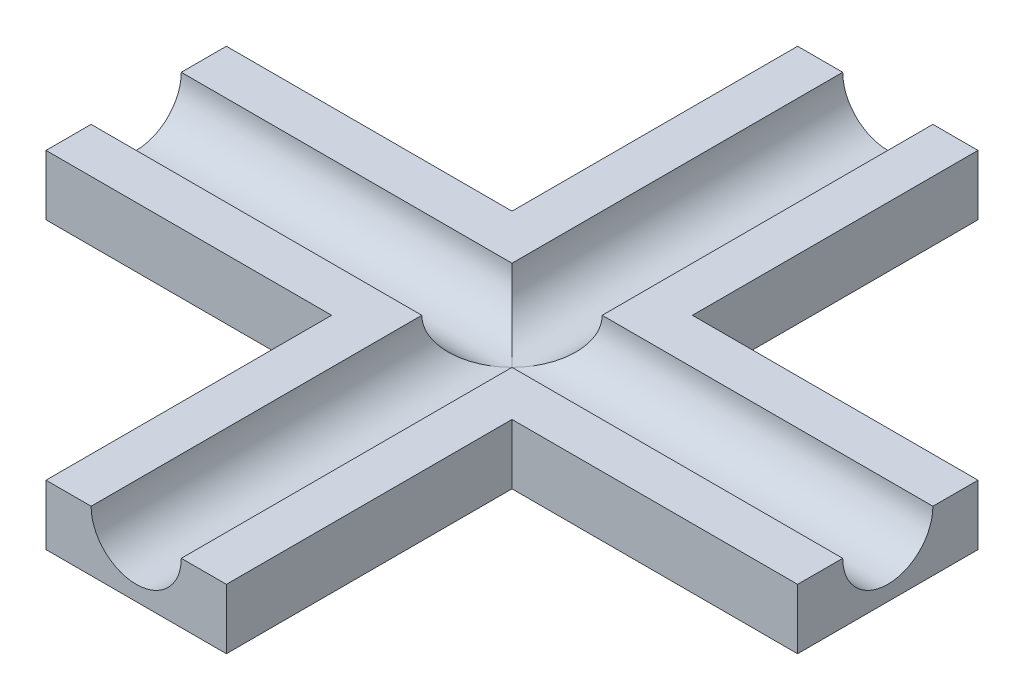
ISO-10303-21;
HEADER;
FILE_DESCRIPTION(('STEP AP214'),'2;1');
FILE_NAME('part.step','',(''),(''),'','','');
FILE_SCHEMA(('AUTOMOTIVE_DESIGN { 1 0 10303 214 1 1 1 1 }'));
ENDSEC;
DATA;
#1=APPLICATION_CONTEXT('core data for automotive mechanical design processes');
#2=APPLICATION_PROTOCOL_DEFINITION('international standard','automotive_design',2000,#1);
#3=PRODUCT_CONTEXT('',#1,'mechanical');
#4=PRODUCT('Part','Part','',(#3));
#5=PRODUCT_RELATED_PRODUCT_CATEGORY('part','',(#4));
#6=PRODUCT_DEFINITION_FORMATION('','',#4);
#7=PRODUCT_DEFINITION_CONTEXT('part definition',#1,'design');
#8=PRODUCT_DEFINITION('design','',#6,#7);
#9=PRODUCT_DEFINITION_SHAPE('','',#8);
#10=(LENGTH_UNIT() NAMED_UNIT(*) SI_UNIT(.MILLI.,.METRE.));
#11=(NAMED_UNIT(*) PLANE_ANGLE_UNIT() SI_UNIT($,.RADIAN.));
#12=(NAMED_UNIT(*) SI_UNIT($,.STERADIAN.) SOLID_ANGLE_UNIT());
#13=UNCERTAINTY_MEASURE_WITH_UNIT(LENGTH_MEASURE(1.E-05),#10,'distance_accuracy_value','');
#14=(GEOMETRIC_REPRESENTATION_CONTEXT(3) GLOBAL_UNCERTAINTY_ASSIGNED_CONTEXT((#13)) GLOBAL_UNIT_ASSIGNED_CONTEXT((#10,
#11,#12)) REPRESENTATION_CONTEXT('',''));
#15=CARTESIAN_POINT('',(0.,0.,0.));
#16=DIRECTION('',(0.,0.,1.));
#17=DIRECTION('',(1.,0.,0.));
#18=AXIS2_PLACEMENT_3D('',#15,#16,#17);
#19=CARTESIAN_POINT('',(-25.001,4.,0.));
#20=DIRECTION('',(1.,0.,0.));
#21=DIRECTION('',(0.,0.,-1.));
#22=AXIS2_PLACEMENT_3D('',#19,#20,#21);
#23=CYLINDRICAL_SURFACE('',#22,3.);
#24=CARTESIAN_POINT('',(0.,4.,0.));
#25=DIRECTION('',(0.707106781186551,0.,-0.707106781186544));
#26=DIRECTION('',(-0.707106781186544,0.,-0.707106781186551));
#27=AXIS2_PLACEMENT_3D('',#24,#25,#26);
#28=ELLIPSE('',#27,4.24264068711926,3.);
#29=CARTESIAN_POINT('',(-2.99999999999997,4.,-3.));
#30=VERTEX_POINT('',#29);
#31=CARTESIAN_POINT('',(0.,1.,0.));
#32=VERTEX_POINT('',#31);
#33=EDGE_CURVE('E206',#30,#32,#28,.F.);
#34=ORIENTED_EDGE('',*,*,#33,.F.);
#35=DIRECTION('',(1.,0.,0.));
#36=VECTOR('',#35,1.);
#37=CARTESIAN_POINT('',(-25.001,4.,-3.));
#38=LINE('',#37,#36);
#39=CARTESIAN_POINT('',(-25.,4.,-3.));
#40=VERTEX_POINT('',#39);
#41=EDGE_CURVE('E329',#30,#40,#38,.F.);
#42=ORIENTED_EDGE('',*,*,#41,.T.);
#43=CARTESIAN_POINT('',(-25.,4.,0.));
#44=DIRECTION('',(1.,0.,0.));
#45=DIRECTION('',(0.,0.,-1.));
#46=AXIS2_PLACEMENT_3D('',#43,#44,#45);
#47=CIRCLE('',#46,3.);
#48=CARTESIAN_POINT('',(-25.,4.,3.));
#49=VERTEX_POINT('',#48);
#50=EDGE_CURVE('E225',#40,#49,#47,.F.);
#51=ORIENTED_EDGE('',*,*,#50,.T.);
#52=DIRECTION('',(1.,0.,0.));
#53=VECTOR('',#52,1.);
#54=CARTESIAN_POINT('',(-25.001,4.,3.));
#55=LINE('',#54,#53);
#56=CARTESIAN_POINT('',(-3.00000000000001,4.,3.));
#57=VERTEX_POINT('',#56);
#58=EDGE_CURVE('E303',#49,#57,#55,.T.);
#59=ORIENTED_EDGE('',*,*,#58,.T.);
#60=CARTESIAN_POINT('',(0.,4.,0.));
#61=DIRECTION('',(0.707106781186546,0.,0.707106781186549));
#62=DIRECTION('',(-0.707106781186549,0.,0.707106781186546));
#63=AXIS2_PLACEMENT_3D('',#60,#61,#62);
#64=ELLIPSE('',#63,4.24264068711929,3.);
#65=EDGE_CURVE('E214',#32,#57,#64,.F.);
#66=ORIENTED_EDGE('',*,*,#65,.F.);
#67=EDGE_LOOP('',(#34,#42,#51,#59,#66));
#68=FACE_BOUND('',#67,.T.);
#69=ADVANCED_FACE('F33',(#68),#23,.F.);
#70=CARTESIAN_POINT('',(-25.,10.,25.));
#71=DIRECTION('',(1.,0.,0.));
#72=DIRECTION('',(0.,0.,-1.));
#73=AXIS2_PLACEMENT_3D('',#70,#71,#72);
#74=PLANE('',#73);
#75=DIRECTION('',(0.,1.,0.));
#76=VECTOR('',#75,1.);
#77=CARTESIAN_POINT('',(-25.,-0.000999999999999265,6.00000000000001));
#78=LINE('',#77,#76);
#79=CARTESIAN_POINT('',(-25.,0.,6.00000000000001));
#80=VERTEX_POINT('',#79);
#81=CARTESIAN_POINT('',(-25.,4.,6.00000000000001));
#82=VERTEX_POINT('',#81);
#83=EDGE_CURVE('E271',#80,#82,#78,.T.);
#84=ORIENTED_EDGE('',*,*,#83,.T.);
#85=DIRECTION('',(0.,0.,-1.));
#86=VECTOR('',#85,1.);
#87=CARTESIAN_POINT('',(-25.,4.,25.));
#88=LINE('',#87,#86);
#89=EDGE_CURVE('E281',#82,#49,#88,.T.);
#90=ORIENTED_EDGE('',*,*,#89,.T.);
#91=ORIENTED_EDGE('',*,*,#50,.F.);
#92=CARTESIAN_POINT('',(-25.,4.,-6.));
#93=VERTEX_POINT('',#92);
#94=EDGE_CURVE('E305',#40,#93,#88,.T.);
#95=ORIENTED_EDGE('',*,*,#94,.T.);
#96=DIRECTION('',(0.,1.,0.));
#97=VECTOR('',#96,1.);
#98=CARTESIAN_POINT('',(-25.,-0.000999999999999265,-6.));
#99=LINE('',#98,#97);
#100=CARTESIAN_POINT('',(-25.,0.,-6.));
#101=VERTEX_POINT('',#100);
#102=EDGE_CURVE('E257',#101,#93,#99,.T.);
#103=ORIENTED_EDGE('',*,*,#102,.F.);
#104=DIRECTION('',(0.,0.,1.));
#105=VECTOR('',#104,1.);
#106=CARTESIAN_POINT('',(-25.,0.,25.));
#107=LINE('',#106,#105);
#108=EDGE_CURVE('E228',#101,#80,#107,.T.);
#109=ORIENTED_EDGE('',*,*,#108,.T.);
#110=EDGE_LOOP('',(#84,#90,#91,#95,#103,#109));
#111=FACE_BOUND('',#110,.T.);
#112=ADVANCED_FACE('F35',(#111),#74,.F.);
#113=CARTESIAN_POINT('',(25.,10.,25.));
#114=DIRECTION('',(0.,0.,-1.));
#115=DIRECTION('',(-1.,0.,0.));
#116=AXIS2_PLACEMENT_3D('',#113,#114,#115);
#117=PLANE('',#116);
#118=DIRECTION('',(0.,1.,0.));
#119=VECTOR('',#118,1.);
#120=CARTESIAN_POINT('',(6.,-0.000999999999999265,25.));
#121=LINE('',#120,#119);
#122=CARTESIAN_POINT('',(6.,0.,25.));
#123=VERTEX_POINT('',#122);
#124=CARTESIAN_POINT('',(6.,4.,25.));
#125=VERTEX_POINT('',#124);
#126=EDGE_CURVE('E181',#123,#125,#121,.T.);
#127=ORIENTED_EDGE('',*,*,#126,.T.);
#128=DIRECTION('',(-1.,0.,0.));
#129=VECTOR('',#128,1.);
#130=CARTESIAN_POINT('',(25.,4.,25.));
#131=LINE('',#130,#129);
#132=CARTESIAN_POINT('',(2.99999999999991,4.,25.));
#133=VERTEX_POINT('',#132);
#134=EDGE_CURVE('E164',#125,#133,#131,.T.);
#135=ORIENTED_EDGE('',*,*,#134,.T.);
#136=CARTESIAN_POINT('',(0.,4.,25.));
#137=DIRECTION('',(0.,0.,1.));
#138=DIRECTION('',(1.,0.,0.));
#139=AXIS2_PLACEMENT_3D('',#136,#137,#138);
#140=CIRCLE('',#139,3.);
#141=CARTESIAN_POINT('',(-3.00000000000009,4.,25.));
#142=VERTEX_POINT('',#141);
#143=EDGE_CURVE('E217',#142,#133,#140,.T.);
#144=ORIENTED_EDGE('',*,*,#143,.F.);
#145=CARTESIAN_POINT('',(-6.00000000000001,4.,25.));
#146=VERTEX_POINT('',#145);
#147=EDGE_CURVE('E299',#142,#146,#131,.T.);
#148=ORIENTED_EDGE('',*,*,#147,.T.);
#149=DIRECTION('',(0.,1.,0.));
#150=VECTOR('',#149,1.);
#151=CARTESIAN_POINT('',(-6.00000000000001,-0.000999999999999265,25.));
#152=LINE('',#151,#150);
#153=CARTESIAN_POINT('',(-6.00000000000001,0.,25.));
#154=VERTEX_POINT('',#153);
#155=EDGE_CURVE('E274',#154,#146,#152,.T.);
#156=ORIENTED_EDGE('',*,*,#155,.F.);
#157=DIRECTION('',(1.,0.,0.));
#158=VECTOR('',#157,1.);
#159=CARTESIAN_POINT('',(25.,0.,25.));
#160=LINE('',#159,#158);
#161=EDGE_CURVE('E231',#154,#123,#160,.T.);
#162=ORIENTED_EDGE('',*,*,#161,.T.);
#163=EDGE_LOOP('',(#127,#135,#144,#148,#156,#162));
#164=FACE_BOUND('',#163,.T.);
#165=ADVANCED_FACE('F297',(#164),#117,.F.);
#166=CARTESIAN_POINT('',(25.,10.,25.));
#167=DIRECTION('',(-1.,0.,0.));
#168=DIRECTION('',(0.,0.,1.));
#169=AXIS2_PLACEMENT_3D('',#166,#167,#168);
#170=PLANE('',#169);
#171=DIRECTION('',(0.,1.,0.));
#172=VECTOR('',#171,1.);
#173=CARTESIAN_POINT('',(25.,-0.000999999999999265,-6.00000000000001));
#174=LINE('',#173,#172);
#175=CARTESIAN_POINT('',(25.,0.,-6.00000000000001));
#176=VERTEX_POINT('',#175);
#177=CARTESIAN_POINT('',(25.,4.,-6.00000000000001));
#178=VERTEX_POINT('',#177);
#179=EDGE_CURVE('E197',#176,#178,#174,.T.);
#180=ORIENTED_EDGE('',*,*,#179,.T.);
#181=DIRECTION('',(0.,0.,1.));
#182=VECTOR('',#181,1.);
#183=CARTESIAN_POINT('',(25.,4.,25.));
#184=LINE('',#183,#182);
#185=CARTESIAN_POINT('',(25.,4.,-3.));
#186=VERTEX_POINT('',#185);
#187=EDGE_CURVE('E313',#178,#186,#184,.T.);
#188=ORIENTED_EDGE('',*,*,#187,.T.);
#189=CARTESIAN_POINT('',(25.,4.,0.));
#190=DIRECTION('',(1.,0.,0.));
#191=DIRECTION('',(0.,0.,-1.));
#192=AXIS2_PLACEMENT_3D('',#189,#190,#191);
#193=CIRCLE('',#192,3.);
#194=CARTESIAN_POINT('',(25.,4.,3.));
#195=VERTEX_POINT('',#194);
#196=EDGE_CURVE('E222',#195,#186,#193,.T.);
#197=ORIENTED_EDGE('',*,*,#196,.F.);
#198=CARTESIAN_POINT('',(25.,4.,6.));
#199=VERTEX_POINT('',#198);
#200=EDGE_CURVE('E175',#195,#199,#184,.T.);
#201=ORIENTED_EDGE('',*,*,#200,.T.);
#202=DIRECTION('',(0.,1.,0.));
#203=VECTOR('',#202,1.);
#204=CARTESIAN_POINT('',(25.,-0.000999999999999265,6.));
#205=LINE('',#204,#203);
#206=CARTESIAN_POINT('',(25.,0.,6.));
#207=VERTEX_POINT('',#206);
#208=EDGE_CURVE('E174',#207,#199,#205,.T.);
#209=ORIENTED_EDGE('',*,*,#208,.F.);
#210=DIRECTION('',(0.,0.,-1.));
#211=VECTOR('',#210,1.);
#212=CARTESIAN_POINT('',(25.,0.,25.));
#213=LINE('',#212,#211);
#214=EDGE_CURVE('E234',#207,#176,#213,.T.);
#215=ORIENTED_EDGE('',*,*,#214,.T.);
#216=EDGE_LOOP('',(#180,#188,#197,#201,#209,#215));
#217=FACE_BOUND('',#216,.T.);
#218=ADVANCED_FACE('F344',(#217),#170,.F.);
#219=CARTESIAN_POINT('',(25.,10.,-25.));
#220=DIRECTION('',(0.,0.,1.));
#221=DIRECTION('',(1.,0.,0.));
#222=AXIS2_PLACEMENT_3D('',#219,#220,#221);
#223=PLANE('',#222);
#224=DIRECTION('',(0.,1.,0.));
#225=VECTOR('',#224,1.);
#226=CARTESIAN_POINT('',(-6.,-0.000999999999999265,-25.));
#227=LINE('',#226,#225);
#228=CARTESIAN_POINT('',(-6.,0.,-25.));
#229=VERTEX_POINT('',#228);
#230=CARTESIAN_POINT('',(-6.,4.,-25.));
#231=VERTEX_POINT('',#230);
#232=EDGE_CURVE('E194',#229,#231,#227,.T.);
#233=ORIENTED_EDGE('',*,*,#232,.T.);
#234=DIRECTION('',(1.,0.,0.));
#235=VECTOR('',#234,1.);
#236=CARTESIAN_POINT('',(25.,4.,-25.));
#237=LINE('',#236,#235);
#238=CARTESIAN_POINT('',(-2.99999999999974,4.,-25.));
#239=VERTEX_POINT('',#238);
#240=EDGE_CURVE('E322',#231,#239,#237,.T.);
#241=ORIENTED_EDGE('',*,*,#240,.T.);
#242=CARTESIAN_POINT('',(2.61861100413235E-13,4.,-25.));
#243=DIRECTION('',(0.,0.,-1.));
#244=DIRECTION('',(-1.,0.,0.));
#245=AXIS2_PLACEMENT_3D('',#242,#243,#244);
#246=CIRCLE('',#245,3.);
#247=CARTESIAN_POINT('',(3.00000000000026,4.,-25.));
#248=VERTEX_POINT('',#247);
#249=EDGE_CURVE('E208',#248,#239,#246,.T.);
#250=ORIENTED_EDGE('',*,*,#249,.F.);
#251=CARTESIAN_POINT('',(6.,4.,-25.));
#252=VERTEX_POINT('',#251);
#253=EDGE_CURVE('E318',#248,#252,#237,.T.);
#254=ORIENTED_EDGE('',*,*,#253,.T.);
#255=DIRECTION('',(0.,1.,0.));
#256=VECTOR('',#255,1.);
#257=CARTESIAN_POINT('',(6.,-0.000999999999999265,-25.));
#258=LINE('',#257,#256);
#259=CARTESIAN_POINT('',(6.,0.,-25.));
#260=VERTEX_POINT('',#259);
#261=EDGE_CURVE('E196',#260,#252,#258,.T.);
#262=ORIENTED_EDGE('',*,*,#261,.F.);
#263=DIRECTION('',(-1.,0.,0.));
#264=VECTOR('',#263,1.);
#265=CARTESIAN_POINT('',(25.,0.,-25.));
#266=LINE('',#265,#264);
#267=EDGE_CURVE('E41',#260,#229,#266,.T.);
#268=ORIENTED_EDGE('',*,*,#267,.T.);
#269=EDGE_LOOP('',(#233,#241,#250,#254,#262,#268));
#270=FACE_BOUND('',#269,.T.);
#271=ADVANCED_FACE('F241',(#270),#223,.F.);
#272=CARTESIAN_POINT('',(0.,0.,0.));
#273=DIRECTION('',(0.,1.,0.));
#274=DIRECTION('',(0.,0.,1.));
#275=AXIS2_PLACEMENT_3D('',#272,#273,#274);
#276=PLANE('',#275);
#277=ORIENTED_EDGE('',*,*,#214,.F.);
#278=DIRECTION('',(1.,0.,0.));
#279=VECTOR('',#278,1.);
#280=CARTESIAN_POINT('',(25.,0.,6.));
#281=LINE('',#280,#279);
#282=CARTESIAN_POINT('',(6.,0.,6.));
#283=VERTEX_POINT('',#282);
#284=EDGE_CURVE('E182',#283,#207,#281,.T.);
#285=ORIENTED_EDGE('',*,*,#284,.F.);
#286=DIRECTION('',(0.,0.,-1.));
#287=VECTOR('',#286,1.);
#288=CARTESIAN_POINT('',(6.,0.,6.));
#289=LINE('',#288,#287);
#290=EDGE_CURVE('E179',#123,#283,#289,.T.);
#291=ORIENTED_EDGE('',*,*,#290,.F.);
#292=ORIENTED_EDGE('',*,*,#161,.F.);
#293=DIRECTION('',(0.,0.,1.));
#294=VECTOR('',#293,1.);
#295=CARTESIAN_POINT('',(-6.00000000000001,0.,6.));
#296=LINE('',#295,#294);
#297=CARTESIAN_POINT('',(-6.00000000000001,0.,6.));
#298=VERTEX_POINT('',#297);
#299=EDGE_CURVE('E190',#298,#154,#296,.T.);
#300=ORIENTED_EDGE('',*,*,#299,.F.);
#301=DIRECTION('',(1.,0.,0.));
#302=VECTOR('',#301,1.);
#303=CARTESIAN_POINT('',(-6.00000000000001,0.,6.));
#304=LINE('',#303,#302);
#305=EDGE_CURVE('E269',#80,#298,#304,.T.);
#306=ORIENTED_EDGE('',*,*,#305,.F.);
#307=ORIENTED_EDGE('',*,*,#108,.F.);
#308=DIRECTION('',(-1.,0.,0.));
#309=VECTOR('',#308,1.);
#310=CARTESIAN_POINT('',(-6.,0.,-6.));
#311=LINE('',#310,#309);
#312=CARTESIAN_POINT('',(-6.,0.,-6.));
#313=VERTEX_POINT('',#312);
#314=EDGE_CURVE('E253',#313,#101,#311,.T.);
#315=ORIENTED_EDGE('',*,*,#314,.F.);
#316=DIRECTION('',(0.,0.,1.));
#317=VECTOR('',#316,1.);
#318=CARTESIAN_POINT('',(-6.,0.,-25.));
#319=LINE('',#318,#317);
#320=EDGE_CURVE('E251',#229,#313,#319,.T.);
#321=ORIENTED_EDGE('',*,*,#320,.F.);
#322=ORIENTED_EDGE('',*,*,#267,.F.);
#323=DIRECTION('',(0.,0.,-1.));
#324=VECTOR('',#323,1.);
#325=CARTESIAN_POINT('',(6.,0.,-25.));
#326=LINE('',#325,#324);
#327=CARTESIAN_POINT('',(6.00000000000001,0.,-6.00000000000001));
#328=VERTEX_POINT('',#327);
#329=EDGE_CURVE('E191',#328,#260,#326,.T.);
#330=ORIENTED_EDGE('',*,*,#329,.F.);
#331=DIRECTION('',(-1.,0.,0.));
#332=VECTOR('',#331,1.);
#333=CARTESIAN_POINT('',(25.,0.,-6.00000000000001));
#334=LINE('',#333,#332);
#335=EDGE_CURVE('E193',#176,#328,#334,.T.);
#336=ORIENTED_EDGE('',*,*,#335,.F.);
#337=EDGE_LOOP('',(#277,#285,#291,#292,#300,#306,#307,#315,#321,#322,#330,#336));
#338=FACE_BOUND('',#337,.T.);
#339=ADVANCED_FACE('F248',(#338),#276,.F.);
#340=ORIENTED_EDGE('',*,*,#196,.T.);
#341=DIRECTION('',(1.,0.,0.));
#342=VECTOR('',#341,1.);
#343=CARTESIAN_POINT('',(-25.001,4.,-3.));
#344=LINE('',#343,#342);
#345=CARTESIAN_POINT('',(3.00000000000003,4.,-3.));
#346=VERTEX_POINT('',#345);
#347=EDGE_CURVE('E185',#186,#346,#344,.F.);
#348=ORIENTED_EDGE('',*,*,#347,.T.);
#349=CARTESIAN_POINT('',(0.,4.,0.));
#350=DIRECTION('',(-0.707106781186544,0.,-0.707106781186551));
#351=DIRECTION('',(0.707106781186551,0.,-0.707106781186544));
#352=AXIS2_PLACEMENT_3D('',#349,#350,#351);
#353=ELLIPSE('',#352,4.24264068711931,3.);
#354=EDGE_CURVE('E200',#32,#346,#353,.F.);
#355=ORIENTED_EDGE('',*,*,#354,.F.);
#356=CARTESIAN_POINT('',(0.,4.,0.));
#357=DIRECTION('',(-0.707106781186549,0.,0.707106781186546));
#358=DIRECTION('',(0.707106781186546,0.,0.707106781186549));
#359=AXIS2_PLACEMENT_3D('',#356,#357,#358);
#360=ELLIPSE('',#359,4.24264068711928,3.);
#361=CARTESIAN_POINT('',(2.99999999999999,4.,3.));
#362=VERTEX_POINT('',#361);
#363=EDGE_CURVE('E213',#362,#32,#360,.F.);
#364=ORIENTED_EDGE('',*,*,#363,.F.);
#365=DIRECTION('',(1.,0.,0.));
#366=VECTOR('',#365,1.);
#367=CARTESIAN_POINT('',(-25.001,4.,3.));
#368=LINE('',#367,#366);
#369=EDGE_CURVE('E312',#362,#195,#368,.T.);
#370=ORIENTED_EDGE('',*,*,#369,.T.);
#371=EDGE_LOOP('',(#340,#348,#355,#364,#370));
#372=FACE_BOUND('',#371,.T.);
#373=ADVANCED_FACE('F341',(#372),#23,.F.);
#374=CARTESIAN_POINT('',(-2.61871574857254E-13,4.,25.0010000000003));
#375=DIRECTION('',(0.,0.,-1.));
#376=DIRECTION('',(-1.,0.,0.));
#377=AXIS2_PLACEMENT_3D('',#374,#375,#376);
#378=CYLINDRICAL_SURFACE('',#377,3.);
#379=ORIENTED_EDGE('',*,*,#249,.T.);
#380=DIRECTION('',(0.,0.,-1.));
#381=VECTOR('',#380,1.);
#382=CARTESIAN_POINT('',(-3.00000000000026,4.,25.0010000000002));
#383=LINE('',#382,#381);
#384=EDGE_CURVE('E506',#239,#30,#383,.F.);
#385=ORIENTED_EDGE('',*,*,#384,.T.);
#386=ORIENTED_EDGE('',*,*,#33,.T.);
#387=ORIENTED_EDGE('',*,*,#354,.T.);
#388=DIRECTION('',(0.,0.,-1.));
#389=VECTOR('',#388,1.);
#390=CARTESIAN_POINT('',(2.99999999999974,4.,25.0010000000003));
#391=LINE('',#390,#389);
#392=EDGE_CURVE('E317',#346,#248,#391,.T.);
#393=ORIENTED_EDGE('',*,*,#392,.T.);
#394=EDGE_LOOP('',(#379,#385,#386,#387,#393));
#395=FACE_BOUND('',#394,.T.);
#396=ADVANCED_FACE('F362',(#395),#378,.F.);
#397=CARTESIAN_POINT('',(0.,4.,-25.0010000000001));
#398=DIRECTION('',(0.,0.,1.));
#399=DIRECTION('',(1.,0.,0.));
#400=AXIS2_PLACEMENT_3D('',#397,#398,#399);
#401=CYLINDRICAL_SURFACE('',#400,3.);
#402=ORIENTED_EDGE('',*,*,#143,.T.);
#403=DIRECTION('',(0.,0.,1.));
#404=VECTOR('',#403,1.);
#405=CARTESIAN_POINT('',(3.00000000000009,4.,-25.0010000000001));
#406=LINE('',#405,#404);
#407=EDGE_CURVE('E310',#133,#362,#406,.F.);
#408=ORIENTED_EDGE('',*,*,#407,.T.);
#409=ORIENTED_EDGE('',*,*,#363,.T.);
#410=ORIENTED_EDGE('',*,*,#65,.T.);
#411=DIRECTION('',(0.,0.,1.));
#412=VECTOR('',#411,1.);
#413=CARTESIAN_POINT('',(-2.99999999999991,4.,-25.0010000000001));
#414=LINE('',#413,#412);
#415=EDGE_CURVE('E331',#57,#142,#414,.T.);
#416=ORIENTED_EDGE('',*,*,#415,.T.);
#417=EDGE_LOOP('',(#402,#408,#409,#410,#416));
#418=FACE_BOUND('',#417,.T.);
#419=ADVANCED_FACE('F367',(#418),#401,.F.);
#420=CARTESIAN_POINT('',(25.,-0.000999999999999265,-6.00000000000001));
#421=DIRECTION('',(0.,0.,1.));
#422=DIRECTION('',(1.,0.,0.));
#423=AXIS2_PLACEMENT_3D('',#420,#421,#422);
#424=PLANE('',#423);
#425=DIRECTION('',(0.,1.,0.));
#426=VECTOR('',#425,1.);
#427=CARTESIAN_POINT('',(6.00000000000001,-0.000999999999999265,-6.00000000000001));
#428=LINE('',#427,#426);
#429=CARTESIAN_POINT('',(6.00000000000001,4.,-6.00000000000001));
#430=VERTEX_POINT('',#429);
#431=EDGE_CURVE('E201',#328,#430,#428,.T.);
#432=ORIENTED_EDGE('',*,*,#431,.T.);
#433=DIRECTION('',(1.,0.,0.));
#434=VECTOR('',#433,1.);
#435=CARTESIAN_POINT('',(25.,4.,-6.00000000000001));
#436=LINE('',#435,#434);
#437=EDGE_CURVE('E48',#430,#178,#436,.T.);
#438=ORIENTED_EDGE('',*,*,#437,.T.);
#439=ORIENTED_EDGE('',*,*,#179,.F.);
#440=ORIENTED_EDGE('',*,*,#335,.T.);
#441=EDGE_LOOP('',(#432,#438,#439,#440));
#442=FACE_BOUND('',#441,.T.);
#443=ADVANCED_FACE('F399',(#442),#424,.F.);
#444=CARTESIAN_POINT('',(6.,-0.000999999999999265,-25.));
#445=DIRECTION('',(-1.,0.,0.));
#446=DIRECTION('',(0.,0.,1.));
#447=AXIS2_PLACEMENT_3D('',#444,#445,#446);
#448=PLANE('',#447);
#449=ORIENTED_EDGE('',*,*,#261,.T.);
#450=DIRECTION('',(0.,0.,1.));
#451=VECTOR('',#450,1.);
#452=CARTESIAN_POINT('',(6.,4.,-25.));
#453=LINE('',#452,#451);
#454=EDGE_CURVE('E324',#252,#430,#453,.T.);
#455=ORIENTED_EDGE('',*,*,#454,.T.);
#456=ORIENTED_EDGE('',*,*,#431,.F.);
#457=ORIENTED_EDGE('',*,*,#329,.T.);
#458=EDGE_LOOP('',(#449,#455,#456,#457));
#459=FACE_BOUND('',#458,.T.);
#460=ADVANCED_FACE('F408',(#459),#448,.F.);
#461=CARTESIAN_POINT('',(-6.,-0.000999999999999265,-25.));
#462=DIRECTION('',(1.,0.,0.));
#463=DIRECTION('',(0.,0.,-1.));
#464=AXIS2_PLACEMENT_3D('',#461,#462,#463);
#465=PLANE('',#464);
#466=DIRECTION('',(0.,1.,0.));
#467=VECTOR('',#466,1.);
#468=CARTESIAN_POINT('',(-6.,-0.000999999999999265,-6.));
#469=LINE('',#468,#467);
#470=CARTESIAN_POINT('',(-6.,4.,-6.));
#471=VERTEX_POINT('',#470);
#472=EDGE_CURVE('E260',#313,#471,#469,.T.);
#473=ORIENTED_EDGE('',*,*,#472,.T.);
#474=DIRECTION('',(0.,0.,-1.));
#475=VECTOR('',#474,1.);
#476=CARTESIAN_POINT('',(-6.,4.,-25.));
#477=LINE('',#476,#475);
#478=EDGE_CURVE('E56',#471,#231,#477,.T.);
#479=ORIENTED_EDGE('',*,*,#478,.T.);
#480=ORIENTED_EDGE('',*,*,#232,.F.);
#481=ORIENTED_EDGE('',*,*,#320,.T.);
#482=EDGE_LOOP('',(#473,#479,#480,#481));
#483=FACE_BOUND('',#482,.T.);
#484=ADVANCED_FACE('F418',(#483),#465,.F.);
#485=CARTESIAN_POINT('',(-6.,-0.000999999999999265,-6.));
#486=DIRECTION('',(0.,0.,1.));
#487=DIRECTION('',(1.,0.,0.));
#488=AXIS2_PLACEMENT_3D('',#485,#486,#487);
#489=PLANE('',#488);
#490=ORIENTED_EDGE('',*,*,#102,.T.);
#491=DIRECTION('',(1.,0.,0.));
#492=VECTOR('',#491,1.);
#493=CARTESIAN_POINT('',(-6.,4.,-6.));
#494=LINE('',#493,#492);
#495=EDGE_CURVE('E330',#93,#471,#494,.T.);
#496=ORIENTED_EDGE('',*,*,#495,.T.);
#497=ORIENTED_EDGE('',*,*,#472,.F.);
#498=ORIENTED_EDGE('',*,*,#314,.T.);
#499=EDGE_LOOP('',(#490,#496,#497,#498));
#500=FACE_BOUND('',#499,.T.);
#501=ADVANCED_FACE('F428',(#500),#489,.F.);
#502=CARTESIAN_POINT('',(-6.00000000000001,-0.000999999999999265,6.));
#503=DIRECTION('',(0.,0.,-1.));
#504=DIRECTION('',(-1.,0.,0.));
#505=AXIS2_PLACEMENT_3D('',#502,#503,#504);
#506=PLANE('',#505);
#507=DIRECTION('',(0.,1.,0.));
#508=VECTOR('',#507,1.);
#509=CARTESIAN_POINT('',(-6.00000000000001,-0.000999999999999265,6.));
#510=LINE('',#509,#508);
#511=CARTESIAN_POINT('',(-6.00000000000001,4.,6.));
#512=VERTEX_POINT('',#511);
#513=EDGE_CURVE('E262',#298,#512,#510,.T.);
#514=ORIENTED_EDGE('',*,*,#513,.T.);
#515=DIRECTION('',(-1.,0.,0.));
#516=VECTOR('',#515,1.);
#517=CARTESIAN_POINT('',(-6.00000000000001,4.,6.));
#518=LINE('',#517,#516);
#519=EDGE_CURVE('E288',#512,#82,#518,.T.);
#520=ORIENTED_EDGE('',*,*,#519,.T.);
#521=ORIENTED_EDGE('',*,*,#83,.F.);
#522=ORIENTED_EDGE('',*,*,#305,.T.);
#523=EDGE_LOOP('',(#514,#520,#521,#522));
#524=FACE_BOUND('',#523,.T.);
#525=ADVANCED_FACE('F286',(#524),#506,.F.);
#526=CARTESIAN_POINT('',(-6.00000000000001,-0.000999999999999265,6.));
#527=DIRECTION('',(1.,0.,0.));
#528=DIRECTION('',(0.,0.,-1.));
#529=AXIS2_PLACEMENT_3D('',#526,#527,#528);
#530=PLANE('',#529);
#531=ORIENTED_EDGE('',*,*,#155,.T.);
#532=DIRECTION('',(0.,0.,-1.));
#533=VECTOR('',#532,1.);
#534=CARTESIAN_POINT('',(-6.00000000000001,4.,6.));
#535=LINE('',#534,#533);
#536=EDGE_CURVE('E306',#146,#512,#535,.T.);
#537=ORIENTED_EDGE('',*,*,#536,.T.);
#538=ORIENTED_EDGE('',*,*,#513,.F.);
#539=ORIENTED_EDGE('',*,*,#299,.T.);
#540=EDGE_LOOP('',(#531,#537,#538,#539));
#541=FACE_BOUND('',#540,.T.);
#542=ADVANCED_FACE('F293',(#541),#530,.F.);
#543=CARTESIAN_POINT('',(25.,-0.000999999999999265,6.));
#544=DIRECTION('',(0.,0.,-1.));
#545=DIRECTION('',(-1.,0.,0.));
#546=AXIS2_PLACEMENT_3D('',#543,#544,#545);
#547=PLANE('',#546);
#548=ORIENTED_EDGE('',*,*,#208,.T.);
#549=DIRECTION('',(-1.,0.,0.));
#550=VECTOR('',#549,1.);
#551=CARTESIAN_POINT('',(25.,4.,6.));
#552=LINE('',#551,#550);
#553=CARTESIAN_POINT('',(6.,4.,6.));
#554=VERTEX_POINT('',#553);
#555=EDGE_CURVE('E161',#199,#554,#552,.T.);
#556=ORIENTED_EDGE('',*,*,#555,.T.);
#557=DIRECTION('',(0.,1.,0.));
#558=VECTOR('',#557,1.);
#559=CARTESIAN_POINT('',(6.,-0.000999999999999265,6.));
#560=LINE('',#559,#558);
#561=EDGE_CURVE('E171',#283,#554,#560,.T.);
#562=ORIENTED_EDGE('',*,*,#561,.F.);
#563=ORIENTED_EDGE('',*,*,#284,.T.);
#564=EDGE_LOOP('',(#548,#556,#562,#563));
#565=FACE_BOUND('',#564,.T.);
#566=ADVANCED_FACE('F170',(#565),#547,.F.);
#567=CARTESIAN_POINT('',(6.,-0.000999999999999265,6.));
#568=DIRECTION('',(-1.,0.,0.));
#569=DIRECTION('',(0.,0.,1.));
#570=AXIS2_PLACEMENT_3D('',#567,#568,#569);
#571=PLANE('',#570);
#572=ORIENTED_EDGE('',*,*,#561,.T.);
#573=DIRECTION('',(0.,0.,1.));
#574=VECTOR('',#573,1.);
#575=CARTESIAN_POINT('',(6.,4.,6.));
#576=LINE('',#575,#574);
#577=EDGE_CURVE('E11',#554,#125,#576,.T.);
#578=ORIENTED_EDGE('',*,*,#577,.T.);
#579=ORIENTED_EDGE('',*,*,#126,.F.);
#580=ORIENTED_EDGE('',*,*,#290,.T.);
#581=EDGE_LOOP('',(#572,#578,#579,#580));
#582=FACE_BOUND('',#581,.T.);
#583=ADVANCED_FACE('F177',(#582),#571,.F.);
#584=CARTESIAN_POINT('',(0.,4.,0.));
#585=DIRECTION('',(0.,-1.,0.));
#586=DIRECTION('',(0.,0.,-1.));
#587=AXIS2_PLACEMENT_3D('',#584,#585,#586);
#588=PLANE('',#587);
#589=ORIENTED_EDGE('',*,*,#407,.F.);
#590=ORIENTED_EDGE('',*,*,#134,.F.);
#591=ORIENTED_EDGE('',*,*,#577,.F.);
#592=ORIENTED_EDGE('',*,*,#555,.F.);
#593=ORIENTED_EDGE('',*,*,#200,.F.);
#594=ORIENTED_EDGE('',*,*,#369,.F.);
#595=EDGE_LOOP('',(#589,#590,#591,#592,#593,#594));
#596=FACE_BOUND('',#595,.T.);
#597=ADVANCED_FACE('F160',(#596),#588,.F.);
#598=ORIENTED_EDGE('',*,*,#58,.F.);
#599=ORIENTED_EDGE('',*,*,#89,.F.);
#600=ORIENTED_EDGE('',*,*,#519,.F.);
#601=ORIENTED_EDGE('',*,*,#536,.F.);
#602=ORIENTED_EDGE('',*,*,#147,.F.);
#603=ORIENTED_EDGE('',*,*,#415,.F.);
#604=EDGE_LOOP('',(#598,#599,#600,#601,#602,#603));
#605=FACE_BOUND('',#604,.T.);
#606=ADVANCED_FACE('F478',(#605),#588,.F.);
#607=ORIENTED_EDGE('',*,*,#240,.F.);
#608=ORIENTED_EDGE('',*,*,#478,.F.);
#609=ORIENTED_EDGE('',*,*,#495,.F.);
#610=ORIENTED_EDGE('',*,*,#94,.F.);
#611=ORIENTED_EDGE('',*,*,#41,.F.);
#612=ORIENTED_EDGE('',*,*,#384,.F.);
#613=EDGE_LOOP('',(#607,#608,#609,#610,#611,#612));
#614=FACE_BOUND('',#613,.T.);
#615=ADVANCED_FACE('F488',(#614),#588,.F.);
#616=ORIENTED_EDGE('',*,*,#187,.F.);
#617=ORIENTED_EDGE('',*,*,#437,.F.);
#618=ORIENTED_EDGE('',*,*,#454,.F.);
#619=ORIENTED_EDGE('',*,*,#253,.F.);
#620=ORIENTED_EDGE('',*,*,#392,.F.);
#621=ORIENTED_EDGE('',*,*,#347,.F.);
#622=EDGE_LOOP('',(#616,#617,#618,#619,#620,#621));
#623=FACE_BOUND('',#622,.T.);
#624=ADVANCED_FACE('F480',(#623),#588,.F.);
#625=CLOSED_SHELL('',(#69,#112,#165,#218,#271,#339,#373,#396,#419,#443,#460,#484,#501,#525,#542,
#566,#583,#597,#606,#615,#624));
#626=MANIFOLD_SOLID_BREP('B2',#625);
#627=ADVANCED_BREP_SHAPE_REPRESENTATION('',(#18,#626),#14);
#628=SHAPE_DEFINITION_REPRESENTATION(#9,#627);
ENDSEC;
END-ISO-10303-21;
